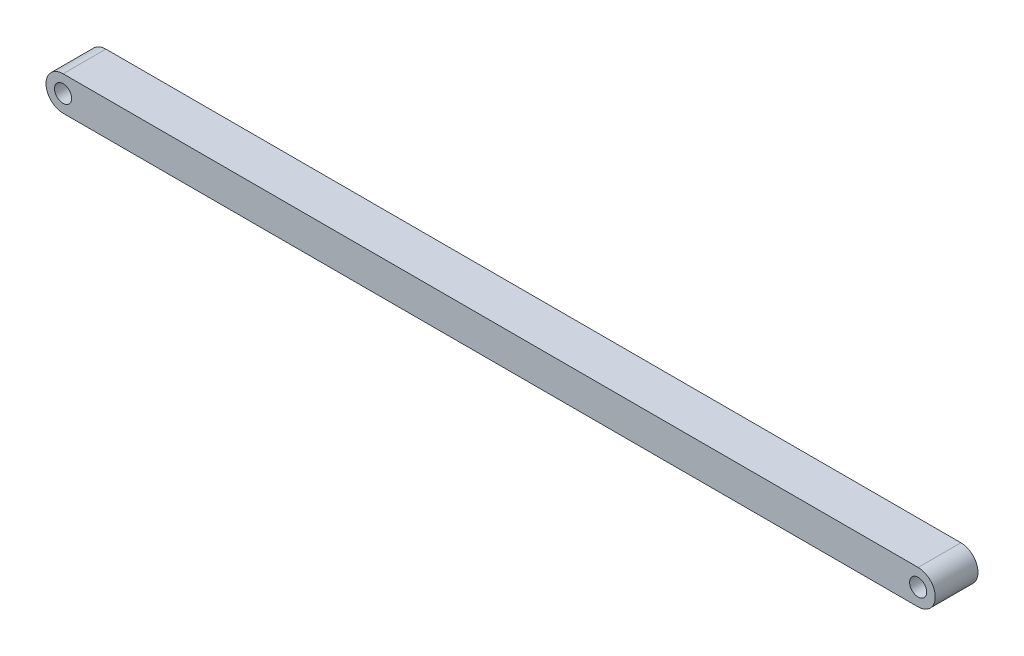
ISO-10303-21;
HEADER;
FILE_DESCRIPTION(('STEP AP214'),'2;1');
FILE_NAME('part.step','',(''),(''),'','','');
FILE_SCHEMA(('AUTOMOTIVE_DESIGN { 1 0 10303 214 1 1 1 1 }'));
ENDSEC;
DATA;
#1=APPLICATION_CONTEXT('core data for automotive mechanical design processes');
#2=APPLICATION_PROTOCOL_DEFINITION('international standard','automotive_design',2000,#1);
#3=PRODUCT_CONTEXT('',#1,'mechanical');
#4=PRODUCT('Part','Part','',(#3));
#5=PRODUCT_RELATED_PRODUCT_CATEGORY('part','',(#4));
#6=PRODUCT_DEFINITION_FORMATION('','',#4);
#7=PRODUCT_DEFINITION_CONTEXT('part definition',#1,'design');
#8=PRODUCT_DEFINITION('design','',#6,#7);
#9=PRODUCT_DEFINITION_SHAPE('','',#8);
#10=(LENGTH_UNIT() NAMED_UNIT(*) SI_UNIT(.MILLI.,.METRE.));
#11=(NAMED_UNIT(*) PLANE_ANGLE_UNIT() SI_UNIT($,.RADIAN.));
#12=(NAMED_UNIT(*) SI_UNIT($,.STERADIAN.) SOLID_ANGLE_UNIT());
#13=UNCERTAINTY_MEASURE_WITH_UNIT(LENGTH_MEASURE(1.E-05),#10,'distance_accuracy_value','');
#14=(GEOMETRIC_REPRESENTATION_CONTEXT(3) GLOBAL_UNCERTAINTY_ASSIGNED_CONTEXT((#13)) GLOBAL_UNIT_ASSIGNED_CONTEXT((#10,
#11,#12)) REPRESENTATION_CONTEXT('',''));
#15=CARTESIAN_POINT('',(0.,0.,0.));
#16=DIRECTION('',(0.,0.,1.));
#17=DIRECTION('',(1.,0.,0.));
#18=AXIS2_PLACEMENT_3D('',#15,#16,#17);
#19=CARTESIAN_POINT('',(0.,0.,5.));
#20=DIRECTION('',(0.,0.,1.));
#21=DIRECTION('',(1.,0.,0.));
#22=AXIS2_PLACEMENT_3D('',#19,#20,#21);
#23=PLANE('',#22);
#24=CARTESIAN_POINT('',(0.,0.,5.));
#25=DIRECTION('',(0.,0.,1.));
#26=DIRECTION('',(1.,0.,0.));
#27=AXIS2_PLACEMENT_3D('',#24,#25,#26);
#28=CIRCLE('',#27,1.);
#29=CARTESIAN_POINT('',(1.,0.,5.));
#30=VERTEX_POINT('',#29);
#31=EDGE_CURVE('E104',#30,#30,#28,.T.);
#32=ORIENTED_EDGE('',*,*,#31,.F.);
#33=EDGE_LOOP('',(#32));
#34=FACE_BOUND('',#33,.T.);
#35=CARTESIAN_POINT('',(0.,0.,5.));
#36=DIRECTION('',(0.,0.,1.));
#37=DIRECTION('',(1.,0.,0.));
#38=AXIS2_PLACEMENT_3D('',#35,#36,#37);
#39=CIRCLE('',#38,2.);
#40=CARTESIAN_POINT('',(0.,2.,5.));
#41=VERTEX_POINT('',#40);
#42=CARTESIAN_POINT('',(0.,-2.,5.));
#43=VERTEX_POINT('',#42);
#44=EDGE_CURVE('E89',#41,#43,#39,.T.);
#45=ORIENTED_EDGE('',*,*,#44,.T.);
#46=DIRECTION('',(1.,0.,0.));
#47=VECTOR('',#46,1.);
#48=CARTESIAN_POINT('',(0.,-2.,5.));
#49=LINE('',#48,#47);
#50=CARTESIAN_POINT('',(100.,-2.,5.));
#51=VERTEX_POINT('',#50);
#52=EDGE_CURVE('E84',#43,#51,#49,.T.);
#53=ORIENTED_EDGE('',*,*,#52,.T.);
#54=CARTESIAN_POINT('',(100.,0.,5.));
#55=DIRECTION('',(0.,0.,1.));
#56=DIRECTION('',(1.,0.,0.));
#57=AXIS2_PLACEMENT_3D('',#54,#55,#56);
#58=CIRCLE('',#57,2.);
#59=CARTESIAN_POINT('',(100.,2.,5.));
#60=VERTEX_POINT('',#59);
#61=EDGE_CURVE('E87',#51,#60,#58,.T.);
#62=ORIENTED_EDGE('',*,*,#61,.T.);
#63=DIRECTION('',(-1.,0.,0.));
#64=VECTOR('',#63,1.);
#65=CARTESIAN_POINT('',(0.,2.,5.));
#66=LINE('',#65,#64);
#67=EDGE_CURVE('E54',#60,#41,#66,.T.);
#68=ORIENTED_EDGE('',*,*,#67,.T.);
#69=EDGE_LOOP('',(#45,#53,#62,#68));
#70=FACE_BOUND('',#69,.T.);
#71=CARTESIAN_POINT('',(100.,0.,5.));
#72=DIRECTION('',(0.,0.,1.));
#73=DIRECTION('',(1.,0.,0.));
#74=AXIS2_PLACEMENT_3D('',#71,#72,#73);
#75=CIRCLE('',#74,0.999999999999998);
#76=CARTESIAN_POINT('',(101.,0.,5.));
#77=VERTEX_POINT('',#76);
#78=EDGE_CURVE('E119',#77,#77,#75,.T.);
#79=ORIENTED_EDGE('',*,*,#78,.F.);
#80=EDGE_LOOP('',(#79));
#81=FACE_BOUND('',#80,.T.);
#82=ADVANCED_FACE('F37',(#34,#70,#81),#23,.T.);
#83=CARTESIAN_POINT('',(0.,0.,0.));
#84=DIRECTION('',(0.,0.,1.));
#85=DIRECTION('',(1.,0.,0.));
#86=AXIS2_PLACEMENT_3D('',#83,#84,#85);
#87=PLANE('',#86);
#88=CARTESIAN_POINT('',(0.,0.,0.));
#89=DIRECTION('',(0.,0.,1.));
#90=DIRECTION('',(1.,0.,0.));
#91=AXIS2_PLACEMENT_3D('',#88,#89,#90);
#92=CIRCLE('',#91,2.);
#93=CARTESIAN_POINT('',(0.,2.,0.));
#94=VERTEX_POINT('',#93);
#95=CARTESIAN_POINT('',(0.,-2.,0.));
#96=VERTEX_POINT('',#95);
#97=EDGE_CURVE('E101',#94,#96,#92,.T.);
#98=ORIENTED_EDGE('',*,*,#97,.F.);
#99=DIRECTION('',(-1.,0.,0.));
#100=VECTOR('',#99,1.);
#101=CARTESIAN_POINT('',(0.,2.,0.));
#102=LINE('',#101,#100);
#103=CARTESIAN_POINT('',(100.,2.,0.));
#104=VERTEX_POINT('',#103);
#105=EDGE_CURVE('E77',#104,#94,#102,.T.);
#106=ORIENTED_EDGE('',*,*,#105,.F.);
#107=CARTESIAN_POINT('',(100.,0.,0.));
#108=DIRECTION('',(0.,0.,1.));
#109=DIRECTION('',(1.,0.,0.));
#110=AXIS2_PLACEMENT_3D('',#107,#108,#109);
#111=CIRCLE('',#110,2.);
#112=CARTESIAN_POINT('',(100.,-2.,0.));
#113=VERTEX_POINT('',#112);
#114=EDGE_CURVE('E71',#113,#104,#111,.T.);
#115=ORIENTED_EDGE('',*,*,#114,.F.);
#116=DIRECTION('',(1.,0.,0.));
#117=VECTOR('',#116,1.);
#118=CARTESIAN_POINT('',(0.,-2.,0.));
#119=LINE('',#118,#117);
#120=EDGE_CURVE('E93',#96,#113,#119,.T.);
#121=ORIENTED_EDGE('',*,*,#120,.F.);
#122=EDGE_LOOP('',(#98,#106,#115,#121));
#123=FACE_BOUND('',#122,.T.);
#124=CARTESIAN_POINT('',(0.,0.,0.));
#125=DIRECTION('',(0.,0.,1.));
#126=DIRECTION('',(1.,0.,0.));
#127=AXIS2_PLACEMENT_3D('',#124,#125,#126);
#128=CIRCLE('',#127,1.);
#129=CARTESIAN_POINT('',(1.,0.,0.));
#130=VERTEX_POINT('',#129);
#131=EDGE_CURVE('E116',#130,#130,#128,.T.);
#132=ORIENTED_EDGE('',*,*,#131,.T.);
#133=EDGE_LOOP('',(#132));
#134=FACE_BOUND('',#133,.T.);
#135=CARTESIAN_POINT('',(100.,0.,0.));
#136=DIRECTION('',(0.,0.,1.));
#137=DIRECTION('',(1.,0.,0.));
#138=AXIS2_PLACEMENT_3D('',#135,#136,#137);
#139=CIRCLE('',#138,0.999999999999998);
#140=CARTESIAN_POINT('',(101.,0.,0.));
#141=VERTEX_POINT('',#140);
#142=EDGE_CURVE('E122',#141,#141,#139,.T.);
#143=ORIENTED_EDGE('',*,*,#142,.T.);
#144=EDGE_LOOP('',(#143));
#145=FACE_BOUND('',#144,.T.);
#146=ADVANCED_FACE('F112',(#123,#134,#145),#87,.F.);
#147=CARTESIAN_POINT('',(0.,0.,5.));
#148=DIRECTION('',(0.,0.,-1.));
#149=DIRECTION('',(-1.,0.,0.));
#150=AXIS2_PLACEMENT_3D('',#147,#148,#149);
#151=CYLINDRICAL_SURFACE('',#150,2.);
#152=ORIENTED_EDGE('',*,*,#97,.T.);
#153=DIRECTION('',(0.,0.,-1.));
#154=VECTOR('',#153,1.);
#155=CARTESIAN_POINT('',(0.,-2.,5.));
#156=LINE('',#155,#154);
#157=EDGE_CURVE('E11',#43,#96,#156,.T.);
#158=ORIENTED_EDGE('',*,*,#157,.F.);
#159=ORIENTED_EDGE('',*,*,#44,.F.);
#160=DIRECTION('',(0.,0.,-1.));
#161=VECTOR('',#160,1.);
#162=CARTESIAN_POINT('',(0.,2.,5.));
#163=LINE('',#162,#161);
#164=EDGE_CURVE('E97',#41,#94,#163,.T.);
#165=ORIENTED_EDGE('',*,*,#164,.T.);
#166=EDGE_LOOP('',(#152,#158,#159,#165));
#167=FACE_BOUND('',#166,.T.);
#168=ADVANCED_FACE('F39',(#167),#151,.T.);
#169=CARTESIAN_POINT('',(0.,-2.,5.));
#170=DIRECTION('',(0.,1.,0.));
#171=DIRECTION('',(0.,0.,1.));
#172=AXIS2_PLACEMENT_3D('',#169,#170,#171);
#173=PLANE('',#172);
#174=ORIENTED_EDGE('',*,*,#120,.T.);
#175=DIRECTION('',(0.,0.,-1.));
#176=VECTOR('',#175,1.);
#177=CARTESIAN_POINT('',(100.,-2.,5.));
#178=LINE('',#177,#176);
#179=EDGE_CURVE('E46',#51,#113,#178,.T.);
#180=ORIENTED_EDGE('',*,*,#179,.F.);
#181=ORIENTED_EDGE('',*,*,#52,.F.);
#182=ORIENTED_EDGE('',*,*,#157,.T.);
#183=EDGE_LOOP('',(#174,#180,#181,#182));
#184=FACE_BOUND('',#183,.T.);
#185=ADVANCED_FACE('F92',(#184),#173,.F.);
#186=CARTESIAN_POINT('',(100.,0.,5.));
#187=DIRECTION('',(0.,0.,-1.));
#188=DIRECTION('',(-1.,0.,0.));
#189=AXIS2_PLACEMENT_3D('',#186,#187,#188);
#190=CYLINDRICAL_SURFACE('',#189,2.);
#191=ORIENTED_EDGE('',*,*,#114,.T.);
#192=DIRECTION('',(0.,0.,-1.));
#193=VECTOR('',#192,1.);
#194=CARTESIAN_POINT('',(100.,2.,5.));
#195=LINE('',#194,#193);
#196=EDGE_CURVE('E94',#60,#104,#195,.T.);
#197=ORIENTED_EDGE('',*,*,#196,.F.);
#198=ORIENTED_EDGE('',*,*,#61,.F.);
#199=ORIENTED_EDGE('',*,*,#179,.T.);
#200=EDGE_LOOP('',(#191,#197,#198,#199));
#201=FACE_BOUND('',#200,.T.);
#202=ADVANCED_FACE('F95',(#201),#190,.T.);
#203=CARTESIAN_POINT('',(0.,2.,5.));
#204=DIRECTION('',(0.,-1.,0.));
#205=DIRECTION('',(0.,0.,-1.));
#206=AXIS2_PLACEMENT_3D('',#203,#204,#205);
#207=PLANE('',#206);
#208=ORIENTED_EDGE('',*,*,#105,.T.);
#209=ORIENTED_EDGE('',*,*,#164,.F.);
#210=ORIENTED_EDGE('',*,*,#67,.F.);
#211=ORIENTED_EDGE('',*,*,#196,.T.);
#212=EDGE_LOOP('',(#208,#209,#210,#211));
#213=FACE_BOUND('',#212,.T.);
#214=ADVANCED_FACE('F109',(#213),#207,.F.);
#215=CARTESIAN_POINT('',(0.,0.,5.));
#216=DIRECTION('',(0.,0.,-1.));
#217=DIRECTION('',(-1.,0.,0.));
#218=AXIS2_PLACEMENT_3D('',#215,#216,#217);
#219=CYLINDRICAL_SURFACE('',#218,1.);
#220=ORIENTED_EDGE('',*,*,#31,.T.);
#221=EDGE_LOOP('',(#220));
#222=FACE_BOUND('',#221,.T.);
#223=ORIENTED_EDGE('',*,*,#131,.F.);
#224=EDGE_LOOP('',(#223));
#225=FACE_BOUND('',#224,.T.);
#226=ADVANCED_FACE('F139',(#222,#225),#219,.F.);
#227=CARTESIAN_POINT('',(100.,0.,5.));
#228=DIRECTION('',(0.,0.,-1.));
#229=DIRECTION('',(-1.,0.,0.));
#230=AXIS2_PLACEMENT_3D('',#227,#228,#229);
#231=CYLINDRICAL_SURFACE('',#230,0.999999999999998);
#232=ORIENTED_EDGE('',*,*,#78,.T.);
#233=EDGE_LOOP('',(#232));
#234=FACE_BOUND('',#233,.T.);
#235=ORIENTED_EDGE('',*,*,#142,.F.);
#236=EDGE_LOOP('',(#235));
#237=FACE_BOUND('',#236,.T.);
#238=ADVANCED_FACE('F128',(#234,#237),#231,.F.);
#239=CLOSED_SHELL('',(#82,#146,#168,#185,#202,#214,#226,#238));
#240=MANIFOLD_SOLID_BREP('B2',#239);
#241=ADVANCED_BREP_SHAPE_REPRESENTATION('',(#18,#240),#14);
#242=SHAPE_DEFINITION_REPRESENTATION(#9,#241);
ENDSEC;
END-ISO-10303-21;
